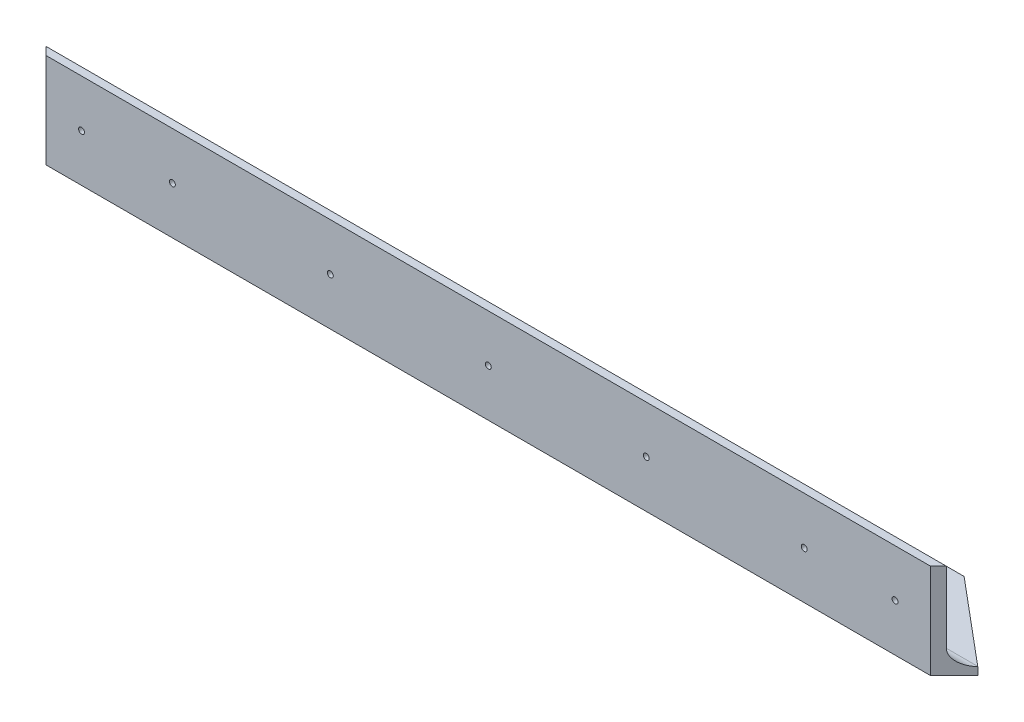
ISO-10303-21;
HEADER;
FILE_DESCRIPTION(('STEP AP214'),'2;1');
FILE_NAME('part.step','',(''),(''),'','','');
FILE_SCHEMA(('AUTOMOTIVE_DESIGN { 1 0 10303 214 1 1 1 1 }'));
ENDSEC;
DATA;
#1=APPLICATION_CONTEXT('core data for automotive mechanical design processes');
#2=APPLICATION_PROTOCOL_DEFINITION('international standard','automotive_design',2000,#1);
#3=PRODUCT_CONTEXT('',#1,'mechanical');
#4=PRODUCT('Part','Part','',(#3));
#5=PRODUCT_RELATED_PRODUCT_CATEGORY('part','',(#4));
#6=PRODUCT_DEFINITION_FORMATION('','',#4);
#7=PRODUCT_DEFINITION_CONTEXT('part definition',#1,'design');
#8=PRODUCT_DEFINITION('design','',#6,#7);
#9=PRODUCT_DEFINITION_SHAPE('','',#8);
#10=(LENGTH_UNIT() NAMED_UNIT(*) SI_UNIT(.MILLI.,.METRE.));
#11=(NAMED_UNIT(*) PLANE_ANGLE_UNIT() SI_UNIT($,.RADIAN.));
#12=(NAMED_UNIT(*) SI_UNIT($,.STERADIAN.) SOLID_ANGLE_UNIT());
#13=UNCERTAINTY_MEASURE_WITH_UNIT(LENGTH_MEASURE(1.E-05),#10,'distance_accuracy_value','');
#14=(GEOMETRIC_REPRESENTATION_CONTEXT(3) GLOBAL_UNCERTAINTY_ASSIGNED_CONTEXT((#13)) GLOBAL_UNIT_ASSIGNED_CONTEXT((#10,
#11,#12)) REPRESENTATION_CONTEXT('',''));
#15=CARTESIAN_POINT('',(0.,0.,0.));
#16=DIRECTION('',(0.,0.,1.));
#17=DIRECTION('',(1.,0.,0.));
#18=AXIS2_PLACEMENT_3D('',#15,#16,#17);
#19=CARTESIAN_POINT('',(673.1,38.1000000000001,-6.35000000000001));
#20=DIRECTION('',(0.,0.,-1.));
#21=DIRECTION('',(0.,1.,0.));
#22=AXIS2_PLACEMENT_3D('',#19,#20,#21);
#23=CYLINDRICAL_SURFACE('',#22,2.38125);
#24=CARTESIAN_POINT('',(673.1,38.1000000000001,0.));
#25=DIRECTION('',(0.,0.,-1.));
#26=DIRECTION('',(0.,1.,0.));
#27=AXIS2_PLACEMENT_3D('',#24,#25,#26);
#28=CIRCLE('',#27,2.38125);
#29=CARTESIAN_POINT('',(673.1,40.4812500000001,0.));
#30=VERTEX_POINT('',#29);
#31=EDGE_CURVE('E51',#30,#30,#28,.T.);
#32=ORIENTED_EDGE('',*,*,#31,.F.);
#33=EDGE_LOOP('',(#32));
#34=FACE_BOUND('',#33,.T.);
#35=CARTESIAN_POINT('',(673.1,38.1000000000001,-6.35000000000001));
#36=DIRECTION('',(0.,0.,-1.));
#37=DIRECTION('',(0.,1.,0.));
#38=AXIS2_PLACEMENT_3D('',#35,#36,#37);
#39=CIRCLE('',#38,2.38125);
#40=CARTESIAN_POINT('',(673.1,40.4812500000001,-6.35000000000001));
#41=VERTEX_POINT('',#40);
#42=EDGE_CURVE('E11',#41,#41,#39,.T.);
#43=ORIENTED_EDGE('',*,*,#42,.T.);
#44=EDGE_LOOP('',(#43));
#45=FACE_BOUND('',#44,.T.);
#46=ADVANCED_FACE('F43',(#34,#45),#23,.F.);
#47=CARTESIAN_POINT('',(165.1,38.1000000000001,-6.34999999999999));
#48=DIRECTION('',(0.,0.,-1.));
#49=DIRECTION('',(0.,1.,0.));
#50=AXIS2_PLACEMENT_3D('',#47,#48,#49);
#51=CYLINDRICAL_SURFACE('',#50,2.38125);
#52=CARTESIAN_POINT('',(165.1,38.1000000000001,0.));
#53=DIRECTION('',(0.,0.,-1.));
#54=DIRECTION('',(0.,1.,0.));
#55=AXIS2_PLACEMENT_3D('',#52,#53,#54);
#56=CIRCLE('',#55,2.38125);
#57=CARTESIAN_POINT('',(165.1,40.4812500000001,0.));
#58=VERTEX_POINT('',#57);
#59=EDGE_CURVE('E264',#58,#58,#56,.T.);
#60=ORIENTED_EDGE('',*,*,#59,.F.);
#61=EDGE_LOOP('',(#60));
#62=FACE_BOUND('',#61,.T.);
#63=CARTESIAN_POINT('',(165.1,38.1000000000001,-6.34999999999999));
#64=DIRECTION('',(0.,0.,-1.));
#65=DIRECTION('',(0.,1.,0.));
#66=AXIS2_PLACEMENT_3D('',#63,#64,#65);
#67=CIRCLE('',#66,2.38125);
#68=CARTESIAN_POINT('',(165.1,40.4812500000001,-6.34999999999999));
#69=VERTEX_POINT('',#68);
#70=EDGE_CURVE('E268',#69,#69,#67,.T.);
#71=ORIENTED_EDGE('',*,*,#70,.T.);
#72=EDGE_LOOP('',(#71));
#73=FACE_BOUND('',#72,.T.);
#74=ADVANCED_FACE('F280',(#62,#73),#51,.F.);
#75=CARTESIAN_POINT('',(736.6,6.35,-44.45));
#76=DIRECTION('',(0.,1.,0.));
#77=DIRECTION('',(0.,0.,1.));
#78=AXIS2_PLACEMENT_3D('',#75,#76,#77);
#79=CYLINDRICAL_SURFACE('',#78,3.373501);
#80=CARTESIAN_POINT('',(736.6,0.,-44.45));
#81=DIRECTION('',(0.,1.,0.));
#82=DIRECTION('',(0.,0.,1.));
#83=AXIS2_PLACEMENT_3D('',#80,#81,#82);
#84=CIRCLE('',#83,3.373501);
#85=CARTESIAN_POINT('',(736.6,0.,-41.076499));
#86=VERTEX_POINT('',#85);
#87=EDGE_CURVE('E244',#86,#86,#84,.T.);
#88=ORIENTED_EDGE('',*,*,#87,.F.);
#89=EDGE_LOOP('',(#88));
#90=FACE_BOUND('',#89,.T.);
#91=CARTESIAN_POINT('',(736.6,6.35,-44.45));
#92=DIRECTION('',(0.,1.,0.));
#93=DIRECTION('',(0.,0.,1.));
#94=AXIS2_PLACEMENT_3D('',#91,#92,#93);
#95=CIRCLE('',#94,3.373501);
#96=CARTESIAN_POINT('',(736.6,6.35,-41.076499));
#97=VERTEX_POINT('',#96);
#98=EDGE_CURVE('E248',#97,#97,#95,.T.);
#99=ORIENTED_EDGE('',*,*,#98,.T.);
#100=EDGE_LOOP('',(#99));
#101=FACE_BOUND('',#100,.T.);
#102=ADVANCED_FACE('F327',(#90,#101),#79,.F.);
#103=CARTESIAN_POINT('',(609.6,6.35,-44.45));
#104=DIRECTION('',(0.,1.,0.));
#105=DIRECTION('',(0.,0.,1.));
#106=AXIS2_PLACEMENT_3D('',#103,#104,#105);
#107=CYLINDRICAL_SURFACE('',#106,3.373501);
#108=CARTESIAN_POINT('',(609.6,0.,-44.45));
#109=DIRECTION('',(0.,1.,0.));
#110=DIRECTION('',(0.,0.,1.));
#111=AXIS2_PLACEMENT_3D('',#108,#109,#110);
#112=CIRCLE('',#111,3.373501);
#113=CARTESIAN_POINT('',(609.6,0.,-41.076499));
#114=VERTEX_POINT('',#113);
#115=EDGE_CURVE('E236',#114,#114,#112,.T.);
#116=ORIENTED_EDGE('',*,*,#115,.F.);
#117=EDGE_LOOP('',(#116));
#118=FACE_BOUND('',#117,.T.);
#119=CARTESIAN_POINT('',(609.6,6.35,-44.45));
#120=DIRECTION('',(0.,1.,0.));
#121=DIRECTION('',(0.,0.,1.));
#122=AXIS2_PLACEMENT_3D('',#119,#120,#121);
#123=CIRCLE('',#122,3.373501);
#124=CARTESIAN_POINT('',(609.6,6.35,-41.076499));
#125=VERTEX_POINT('',#124);
#126=EDGE_CURVE('E240',#125,#125,#123,.T.);
#127=ORIENTED_EDGE('',*,*,#126,.T.);
#128=EDGE_LOOP('',(#127));
#129=FACE_BOUND('',#128,.T.);
#130=ADVANCED_FACE('F323',(#118,#129),#107,.F.);
#131=CARTESIAN_POINT('',(482.6,6.35,-44.45));
#132=DIRECTION('',(0.,1.,0.));
#133=DIRECTION('',(0.,0.,1.));
#134=AXIS2_PLACEMENT_3D('',#131,#132,#133);
#135=CYLINDRICAL_SURFACE('',#134,3.373501);
#136=CARTESIAN_POINT('',(482.6,0.,-44.45));
#137=DIRECTION('',(0.,1.,0.));
#138=DIRECTION('',(0.,0.,1.));
#139=AXIS2_PLACEMENT_3D('',#136,#137,#138);
#140=CIRCLE('',#139,3.373501);
#141=CARTESIAN_POINT('',(482.6,0.,-41.076499));
#142=VERTEX_POINT('',#141);
#143=EDGE_CURVE('E228',#142,#142,#140,.T.);
#144=ORIENTED_EDGE('',*,*,#143,.F.);
#145=EDGE_LOOP('',(#144));
#146=FACE_BOUND('',#145,.T.);
#147=CARTESIAN_POINT('',(482.6,6.35,-44.45));
#148=DIRECTION('',(0.,1.,0.));
#149=DIRECTION('',(0.,0.,1.));
#150=AXIS2_PLACEMENT_3D('',#147,#148,#149);
#151=CIRCLE('',#150,3.373501);
#152=CARTESIAN_POINT('',(482.6,6.35,-41.076499));
#153=VERTEX_POINT('',#152);
#154=EDGE_CURVE('E232',#153,#153,#151,.T.);
#155=ORIENTED_EDGE('',*,*,#154,.T.);
#156=EDGE_LOOP('',(#155));
#157=FACE_BOUND('',#156,.T.);
#158=ADVANCED_FACE('F319',(#146,#157),#135,.F.);
#159=CARTESIAN_POINT('',(355.6,6.35,-44.45));
#160=DIRECTION('',(0.,1.,0.));
#161=DIRECTION('',(0.,0.,1.));
#162=AXIS2_PLACEMENT_3D('',#159,#160,#161);
#163=CYLINDRICAL_SURFACE('',#162,3.373501);
#164=CARTESIAN_POINT('',(355.6,0.,-44.45));
#165=DIRECTION('',(0.,1.,0.));
#166=DIRECTION('',(0.,0.,1.));
#167=AXIS2_PLACEMENT_3D('',#164,#165,#166);
#168=CIRCLE('',#167,3.373501);
#169=CARTESIAN_POINT('',(355.6,0.,-41.076499));
#170=VERTEX_POINT('',#169);
#171=EDGE_CURVE('E220',#170,#170,#168,.T.);
#172=ORIENTED_EDGE('',*,*,#171,.F.);
#173=EDGE_LOOP('',(#172));
#174=FACE_BOUND('',#173,.T.);
#175=CARTESIAN_POINT('',(355.6,6.35,-44.45));
#176=DIRECTION('',(0.,1.,0.));
#177=DIRECTION('',(0.,0.,1.));
#178=AXIS2_PLACEMENT_3D('',#175,#176,#177);
#179=CIRCLE('',#178,3.373501);
#180=CARTESIAN_POINT('',(355.6,6.35,-41.076499));
#181=VERTEX_POINT('',#180);
#182=EDGE_CURVE('E224',#181,#181,#179,.T.);
#183=ORIENTED_EDGE('',*,*,#182,.T.);
#184=EDGE_LOOP('',(#183));
#185=FACE_BOUND('',#184,.T.);
#186=ADVANCED_FACE('F311',(#174,#185),#163,.F.);
#187=CARTESIAN_POINT('',(838.2,76.2,0.));
#188=DIRECTION('',(0.,0.,-1.));
#189=DIRECTION('',(0.,1.,0.));
#190=AXIS2_PLACEMENT_3D('',#187,#188,#189);
#191=PLANE('',#190);
#192=CARTESIAN_POINT('',(746.125,38.1,0.));
#193=DIRECTION('',(0.,0.,-1.));
#194=DIRECTION('',(0.,1.,0.));
#195=AXIS2_PLACEMENT_3D('',#192,#193,#194);
#196=CIRCLE('',#195,2.38125);
#197=CARTESIAN_POINT('',(746.125,40.48125,0.));
#198=VERTEX_POINT('',#197);
#199=EDGE_CURVE('E616',#198,#198,#196,.T.);
#200=ORIENTED_EDGE('',*,*,#199,.T.);
#201=EDGE_LOOP('',(#200));
#202=FACE_BOUND('',#201,.T.);
#203=CARTESIAN_POINT('',(92.075,38.1,0.));
#204=DIRECTION('',(0.,0.,-1.));
#205=DIRECTION('',(0.,1.,0.));
#206=AXIS2_PLACEMENT_3D('',#203,#204,#205);
#207=CIRCLE('',#206,2.38125);
#208=CARTESIAN_POINT('',(92.075,40.48125,0.));
#209=VERTEX_POINT('',#208);
#210=EDGE_CURVE('E608',#209,#209,#207,.T.);
#211=ORIENTED_EDGE('',*,*,#210,.T.);
#212=EDGE_LOOP('',(#211));
#213=FACE_BOUND('',#212,.T.);
#214=CARTESIAN_POINT('',(546.1,38.1000000000001,0.));
#215=DIRECTION('',(0.,0.,-1.));
#216=DIRECTION('',(0.,1.,0.));
#217=AXIS2_PLACEMENT_3D('',#214,#215,#216);
#218=CIRCLE('',#217,2.38125);
#219=CARTESIAN_POINT('',(546.1,40.4812500000001,0.));
#220=VERTEX_POINT('',#219);
#221=EDGE_CURVE('E604',#220,#220,#218,.T.);
#222=ORIENTED_EDGE('',*,*,#221,.T.);
#223=EDGE_LOOP('',(#222));
#224=FACE_BOUND('',#223,.T.);
#225=CARTESIAN_POINT('',(292.1,38.1000000000001,0.));
#226=DIRECTION('',(0.,0.,-1.));
#227=DIRECTION('',(0.,1.,0.));
#228=AXIS2_PLACEMENT_3D('',#225,#226,#227);
#229=CIRCLE('',#228,2.38125);
#230=CARTESIAN_POINT('',(292.1,40.4812500000001,0.));
#231=VERTEX_POINT('',#230);
#232=EDGE_CURVE('E596',#231,#231,#229,.T.);
#233=ORIENTED_EDGE('',*,*,#232,.T.);
#234=EDGE_LOOP('',(#233));
#235=FACE_BOUND('',#234,.T.);
#236=CARTESIAN_POINT('',(419.1,38.1000000000001,0.));
#237=DIRECTION('',(0.,0.,-1.));
#238=DIRECTION('',(0.,1.,0.));
#239=AXIS2_PLACEMENT_3D('',#236,#237,#238);
#240=CIRCLE('',#239,2.38125);
#241=CARTESIAN_POINT('',(419.1,40.4812500000001,0.));
#242=VERTEX_POINT('',#241);
#243=EDGE_CURVE('E584',#242,#242,#240,.T.);
#244=ORIENTED_EDGE('',*,*,#243,.T.);
#245=EDGE_LOOP('',(#244));
#246=FACE_BOUND('',#245,.T.);
#247=DIRECTION('',(-1.,0.,0.));
#248=VECTOR('',#247,1.);
#249=CARTESIAN_POINT('',(838.2,0.,0.));
#250=LINE('',#249,#248);
#251=CARTESIAN_POINT('',(774.7,0.,0.));
#252=VERTEX_POINT('',#251);
#253=CARTESIAN_POINT('',(63.5,0.,0.));
#254=VERTEX_POINT('',#253);
#255=EDGE_CURVE('E210',#252,#254,#250,.T.);
#256=ORIENTED_EDGE('',*,*,#255,.F.);
#257=DIRECTION('',(0.,-1.,0.));
#258=VECTOR('',#257,1.);
#259=CARTESIAN_POINT('',(774.7,76.2,0.));
#260=LINE('',#259,#258);
#261=CARTESIAN_POINT('',(774.7,76.2,0.));
#262=VERTEX_POINT('',#261);
#263=EDGE_CURVE('E147',#262,#252,#260,.T.);
#264=ORIENTED_EDGE('',*,*,#263,.F.);
#265=DIRECTION('',(-1.,0.,0.));
#266=VECTOR('',#265,1.);
#267=CARTESIAN_POINT('',(838.2,76.2,0.));
#268=LINE('',#267,#266);
#269=CARTESIAN_POINT('',(63.5,76.2,0.));
#270=VERTEX_POINT('',#269);
#271=EDGE_CURVE('E199',#262,#270,#268,.T.);
#272=ORIENTED_EDGE('',*,*,#271,.T.);
#273=DIRECTION('',(0.,-1.,0.));
#274=VECTOR('',#273,1.);
#275=CARTESIAN_POINT('',(63.5,76.2,0.));
#276=LINE('',#275,#274);
#277=EDGE_CURVE('E173',#270,#254,#276,.T.);
#278=ORIENTED_EDGE('',*,*,#277,.T.);
#279=EDGE_LOOP('',(#256,#264,#272,#278));
#280=FACE_BOUND('',#279,.T.);
#281=ORIENTED_EDGE('',*,*,#59,.T.);
#282=EDGE_LOOP('',(#281));
#283=FACE_BOUND('',#282,.T.);
#284=ORIENTED_EDGE('',*,*,#31,.T.);
#285=EDGE_LOOP('',(#284));
#286=FACE_BOUND('',#285,.T.);
#287=ADVANCED_FACE('F276',(#202,#213,#224,#235,#246,#280,#283,#286),#191,.F.);
#288=CARTESIAN_POINT('',(838.2,0.,0.));
#289=DIRECTION('',(0.,1.,0.));
#290=DIRECTION('',(0.,0.,1.));
#291=AXIS2_PLACEMENT_3D('',#288,#289,#290);
#292=PLANE('',#291);
#293=CARTESIAN_POINT('',(228.6,0.,-44.45));
#294=DIRECTION('',(0.,1.,0.));
#295=DIRECTION('',(0.,0.,1.));
#296=AXIS2_PLACEMENT_3D('',#293,#294,#295);
#297=CIRCLE('',#296,3.373501);
#298=CARTESIAN_POINT('',(228.6,0.,-41.076499));
#299=VERTEX_POINT('',#298);
#300=EDGE_CURVE('E183',#299,#299,#297,.T.);
#301=ORIENTED_EDGE('',*,*,#300,.T.);
#302=EDGE_LOOP('',(#301));
#303=FACE_BOUND('',#302,.T.);
#304=CARTESIAN_POINT('',(101.6,0.,-44.45));
#305=DIRECTION('',(0.,1.,0.));
#306=DIRECTION('',(0.,0.,1.));
#307=AXIS2_PLACEMENT_3D('',#304,#305,#306);
#308=CIRCLE('',#307,3.373501);
#309=CARTESIAN_POINT('',(101.6,0.,-41.076499));
#310=VERTEX_POINT('',#309);
#311=EDGE_CURVE('E195',#310,#310,#308,.T.);
#312=ORIENTED_EDGE('',*,*,#311,.T.);
#313=EDGE_LOOP('',(#312));
#314=FACE_BOUND('',#313,.T.);
#315=DIRECTION('',(-1.,0.,0.));
#316=VECTOR('',#315,1.);
#317=CARTESIAN_POINT('',(838.2,0.,-76.2));
#318=LINE('',#317,#316);
#319=CARTESIAN_POINT('',(725.42400757447,0.,-76.2));
#320=VERTEX_POINT('',#319);
#321=CARTESIAN_POINT('',(112.775992425529,0.,-76.2));
#322=VERTEX_POINT('',#321);
#323=EDGE_CURVE('E141',#320,#322,#318,.T.);
#324=ORIENTED_EDGE('',*,*,#323,.F.);
#325=DIRECTION('',(0.766044443118975,0.,0.642787609686542));
#326=VECTOR('',#325,1.);
#327=CARTESIAN_POINT('',(725.42400757447,0.,-76.2));
#328=LINE('',#327,#326);
#329=CARTESIAN_POINT('',(793.650867228184,0.,-18.9508672281842));
#330=VERTEX_POINT('',#329);
#331=EDGE_CURVE('E124',#320,#330,#328,.T.);
#332=ORIENTED_EDGE('',*,*,#331,.T.);
#333=DIRECTION('',(0.707106781186551,0.,-0.707106781186544));
#334=VECTOR('',#333,1.);
#335=CARTESIAN_POINT('',(864.325160154726,0.,-89.6251601547247));
#336=LINE('',#335,#334);
#337=EDGE_CURVE('E138',#252,#330,#336,.T.);
#338=ORIENTED_EDGE('',*,*,#337,.F.);
#339=ORIENTED_EDGE('',*,*,#255,.T.);
#340=DIRECTION('',(0.707106781186551,0.,0.707106781186544));
#341=VECTOR('',#340,1.);
#342=CARTESIAN_POINT('',(-28.0524500593167,0.,-91.5524500593158));
#343=LINE('',#342,#341);
#344=CARTESIAN_POINT('',(44.5491327718152,0.,-18.9508672281842));
#345=VERTEX_POINT('',#344);
#346=EDGE_CURVE('E168',#345,#254,#343,.T.);
#347=ORIENTED_EDGE('',*,*,#346,.F.);
#348=DIRECTION('',(0.766044443118976,0.,-0.642787609686542));
#349=VECTOR('',#348,1.);
#350=CARTESIAN_POINT('',(44.5491327718152,0.,-18.9508672281842));
#351=LINE('',#350,#349);
#352=EDGE_CURVE('E562',#345,#322,#351,.T.);
#353=ORIENTED_EDGE('',*,*,#352,.T.);
#354=EDGE_LOOP('',(#324,#332,#338,#339,#347,#353));
#355=FACE_BOUND('',#354,.T.);
#356=ORIENTED_EDGE('',*,*,#171,.T.);
#357=EDGE_LOOP('',(#356));
#358=FACE_BOUND('',#357,.T.);
#359=ORIENTED_EDGE('',*,*,#143,.T.);
#360=EDGE_LOOP('',(#359));
#361=FACE_BOUND('',#360,.T.);
#362=ORIENTED_EDGE('',*,*,#115,.T.);
#363=EDGE_LOOP('',(#362));
#364=FACE_BOUND('',#363,.T.);
#365=ORIENTED_EDGE('',*,*,#87,.T.);
#366=EDGE_LOOP('',(#365));
#367=FACE_BOUND('',#366,.T.);
#368=ADVANCED_FACE('F135',(#303,#314,#355,#358,#361,#364,#367),#292,.F.);
#369=CARTESIAN_POINT('',(838.2,0.,-76.2));
#370=DIRECTION('',(0.,0.,1.));
#371=DIRECTION('',(1.,0.,0.));
#372=AXIS2_PLACEMENT_3D('',#369,#370,#371);
#373=PLANE('',#372);
#374=DIRECTION('',(-1.,0.,0.));
#375=VECTOR('',#374,1.);
#376=CARTESIAN_POINT('',(838.2,6.35,-76.2));
#377=LINE('',#376,#375);
#378=CARTESIAN_POINT('',(725.42400757447,6.35,-76.2));
#379=VERTEX_POINT('',#378);
#380=CARTESIAN_POINT('',(112.775992425529,6.35,-76.2));
#381=VERTEX_POINT('',#380);
#382=EDGE_CURVE('E205',#379,#381,#377,.T.);
#383=ORIENTED_EDGE('',*,*,#382,.F.);
#384=DIRECTION('',(0.,1.,0.));
#385=VECTOR('',#384,1.);
#386=CARTESIAN_POINT('',(725.42400757447,0.,-76.2));
#387=LINE('',#386,#385);
#388=EDGE_CURVE('E130',#320,#379,#387,.T.);
#389=ORIENTED_EDGE('',*,*,#388,.F.);
#390=ORIENTED_EDGE('',*,*,#323,.T.);
#391=DIRECTION('',(0.,1.,0.));
#392=VECTOR('',#391,1.);
#393=CARTESIAN_POINT('',(112.775992425529,0.,-76.2));
#394=LINE('',#393,#392);
#395=EDGE_CURVE('E150',#322,#381,#394,.T.);
#396=ORIENTED_EDGE('',*,*,#395,.T.);
#397=EDGE_LOOP('',(#383,#389,#390,#396));
#398=FACE_BOUND('',#397,.T.);
#399=ADVANCED_FACE('F296',(#398),#373,.F.);
#400=CARTESIAN_POINT('',(838.2,6.35,-76.2));
#401=DIRECTION('',(0.,-1.,0.));
#402=DIRECTION('',(0.,0.,-1.));
#403=AXIS2_PLACEMENT_3D('',#400,#401,#402);
#404=PLANE('',#403);
#405=CARTESIAN_POINT('',(228.6,6.35,-44.45));
#406=DIRECTION('',(0.,1.,0.));
#407=DIRECTION('',(0.,0.,1.));
#408=AXIS2_PLACEMENT_3D('',#405,#406,#407);
#409=CIRCLE('',#408,3.373501);
#410=CARTESIAN_POINT('',(228.6,6.35,-41.076499));
#411=VERTEX_POINT('',#410);
#412=EDGE_CURVE('E187',#411,#411,#409,.T.);
#413=ORIENTED_EDGE('',*,*,#412,.F.);
#414=EDGE_LOOP('',(#413));
#415=FACE_BOUND('',#414,.T.);
#416=CARTESIAN_POINT('',(101.6,6.35,-44.45));
#417=DIRECTION('',(0.,1.,0.));
#418=DIRECTION('',(0.,0.,1.));
#419=AXIS2_PLACEMENT_3D('',#416,#417,#418);
#420=CIRCLE('',#419,3.373501);
#421=CARTESIAN_POINT('',(101.6,6.35,-41.076499));
#422=VERTEX_POINT('',#421);
#423=EDGE_CURVE('E191',#422,#422,#420,.T.);
#424=ORIENTED_EDGE('',*,*,#423,.F.);
#425=EDGE_LOOP('',(#424));
#426=FACE_BOUND('',#425,.T.);
#427=DIRECTION('',(-1.,0.,0.));
#428=VECTOR('',#427,1.);
#429=CARTESIAN_POINT('',(838.2,6.34999999999999,-19.05));
#430=LINE('',#429,#428);
#431=CARTESIAN_POINT('',(44.6672746087706,6.34999999999999,-19.05));
#432=VERTEX_POINT('',#431);
#433=CARTESIAN_POINT('',(793.532725391229,6.34999999999999,-19.05));
#434=VERTEX_POINT('',#433);
#435=EDGE_CURVE('E216',#432,#434,#430,.F.);
#436=ORIENTED_EDGE('',*,*,#435,.T.);
#437=DIRECTION('',(0.766044443118975,0.,0.642787609686542));
#438=VECTOR('',#437,1.);
#439=CARTESIAN_POINT('',(725.42400757447,6.35,-76.2));
#440=LINE('',#439,#438);
#441=EDGE_CURVE('E515',#379,#434,#440,.T.);
#442=ORIENTED_EDGE('',*,*,#441,.F.);
#443=ORIENTED_EDGE('',*,*,#382,.T.);
#444=DIRECTION('',(0.766044443118976,0.,-0.642787609686542));
#445=VECTOR('',#444,1.);
#446=CARTESIAN_POINT('',(44.5491327718152,6.34999999999999,-18.9508672281842));
#447=LINE('',#446,#445);
#448=EDGE_CURVE('E518',#432,#381,#447,.T.);
#449=ORIENTED_EDGE('',*,*,#448,.F.);
#450=EDGE_LOOP('',(#436,#442,#443,#449));
#451=FACE_BOUND('',#450,.T.);
#452=ORIENTED_EDGE('',*,*,#182,.F.);
#453=EDGE_LOOP('',(#452));
#454=FACE_BOUND('',#453,.T.);
#455=ORIENTED_EDGE('',*,*,#154,.F.);
#456=EDGE_LOOP('',(#455));
#457=FACE_BOUND('',#456,.T.);
#458=ORIENTED_EDGE('',*,*,#126,.F.);
#459=EDGE_LOOP('',(#458));
#460=FACE_BOUND('',#459,.T.);
#461=ORIENTED_EDGE('',*,*,#98,.F.);
#462=EDGE_LOOP('',(#461));
#463=FACE_BOUND('',#462,.T.);
#464=ADVANCED_FACE('F286',(#415,#426,#451,#454,#457,#460,#463),#404,.F.);
#465=CARTESIAN_POINT('',(838.2,6.34999999999999,-6.34999999999999));
#466=DIRECTION('',(0.,0.,1.));
#467=DIRECTION('',(0.,-1.,0.));
#468=AXIS2_PLACEMENT_3D('',#465,#466,#467);
#469=PLANE('',#468);
#470=CARTESIAN_POINT('',(746.125,38.1,-6.35));
#471=DIRECTION('',(0.,0.,-1.));
#472=DIRECTION('',(0.,1.,0.));
#473=AXIS2_PLACEMENT_3D('',#470,#471,#472);
#474=CIRCLE('',#473,2.38125);
#475=CARTESIAN_POINT('',(746.125,40.48125,-6.35));
#476=VERTEX_POINT('',#475);
#477=EDGE_CURVE('E620',#476,#476,#474,.T.);
#478=ORIENTED_EDGE('',*,*,#477,.F.);
#479=EDGE_LOOP('',(#478));
#480=FACE_BOUND('',#479,.T.);
#481=CARTESIAN_POINT('',(92.075,38.1,-6.35));
#482=DIRECTION('',(0.,0.,-1.));
#483=DIRECTION('',(0.,1.,0.));
#484=AXIS2_PLACEMENT_3D('',#481,#482,#483);
#485=CIRCLE('',#484,2.38124999999999);
#486=CARTESIAN_POINT('',(92.075,40.48125,-6.35));
#487=VERTEX_POINT('',#486);
#488=EDGE_CURVE('E612',#487,#487,#485,.T.);
#489=ORIENTED_EDGE('',*,*,#488,.F.);
#490=EDGE_LOOP('',(#489));
#491=FACE_BOUND('',#490,.T.);
#492=CARTESIAN_POINT('',(546.1,38.1000000000001,-6.35));
#493=DIRECTION('',(0.,0.,-1.));
#494=DIRECTION('',(0.,1.,0.));
#495=AXIS2_PLACEMENT_3D('',#492,#493,#494);
#496=CIRCLE('',#495,2.38125);
#497=CARTESIAN_POINT('',(546.1,40.4812500000001,-6.35));
#498=VERTEX_POINT('',#497);
#499=EDGE_CURVE('E600',#498,#498,#496,.T.);
#500=ORIENTED_EDGE('',*,*,#499,.F.);
#501=EDGE_LOOP('',(#500));
#502=FACE_BOUND('',#501,.T.);
#503=CARTESIAN_POINT('',(292.1,38.1000000000001,-6.34999999999999));
#504=DIRECTION('',(0.,0.,-1.));
#505=DIRECTION('',(0.,1.,0.));
#506=AXIS2_PLACEMENT_3D('',#503,#504,#505);
#507=CIRCLE('',#506,2.38125);
#508=CARTESIAN_POINT('',(292.1,40.4812500000001,-6.34999999999999));
#509=VERTEX_POINT('',#508);
#510=EDGE_CURVE('E592',#509,#509,#507,.T.);
#511=ORIENTED_EDGE('',*,*,#510,.F.);
#512=EDGE_LOOP('',(#511));
#513=FACE_BOUND('',#512,.T.);
#514=CARTESIAN_POINT('',(419.1,38.1000000000001,-6.35));
#515=DIRECTION('',(0.,0.,-1.));
#516=DIRECTION('',(0.,1.,0.));
#517=AXIS2_PLACEMENT_3D('',#514,#515,#516);
#518=CIRCLE('',#517,2.38125);
#519=CARTESIAN_POINT('',(419.1,40.4812500000001,-6.35));
#520=VERTEX_POINT('',#519);
#521=EDGE_CURVE('E588',#520,#520,#518,.T.);
#522=ORIENTED_EDGE('',*,*,#521,.F.);
#523=EDGE_LOOP('',(#522));
#524=FACE_BOUND('',#523,.T.);
#525=DIRECTION('',(-1.,0.,0.));
#526=VECTOR('',#525,1.);
#527=CARTESIAN_POINT('',(838.2,76.2,-6.35));
#528=LINE('',#527,#526);
#529=CARTESIAN_POINT('',(781.05,76.2,-6.34999999999998));
#530=VERTEX_POINT('',#529);
#531=CARTESIAN_POINT('',(57.1500000000001,76.2,-6.34999999999995));
#532=VERTEX_POINT('',#531);
#533=EDGE_CURVE('E202',#530,#532,#528,.T.);
#534=ORIENTED_EDGE('',*,*,#533,.F.);
#535=DIRECTION('',(0.,-1.,0.));
#536=VECTOR('',#535,1.);
#537=CARTESIAN_POINT('',(781.05,6.35,-6.34999999999999));
#538=LINE('',#537,#536);
#539=CARTESIAN_POINT('',(781.05,19.05,-6.35));
#540=VERTEX_POINT('',#539);
#541=EDGE_CURVE('E164',#530,#540,#538,.T.);
#542=ORIENTED_EDGE('',*,*,#541,.T.);
#543=DIRECTION('',(-1.,0.,0.));
#544=VECTOR('',#543,1.);
#545=CARTESIAN_POINT('',(0.,19.05,-6.35));
#546=LINE('',#545,#544);
#547=CARTESIAN_POINT('',(57.1499999999999,19.05,-6.35));
#548=VERTEX_POINT('',#547);
#549=EDGE_CURVE('E213',#540,#548,#546,.T.);
#550=ORIENTED_EDGE('',*,*,#549,.T.);
#551=DIRECTION('',(0.,1.,0.));
#552=VECTOR('',#551,1.);
#553=CARTESIAN_POINT('',(57.15,6.34999999999993,-6.34999999999999));
#554=LINE('',#553,#552);
#555=EDGE_CURVE('E179',#548,#532,#554,.T.);
#556=ORIENTED_EDGE('',*,*,#555,.T.);
#557=EDGE_LOOP('',(#534,#542,#550,#556));
#558=FACE_BOUND('',#557,.T.);
#559=ORIENTED_EDGE('',*,*,#70,.F.);
#560=EDGE_LOOP('',(#559));
#561=FACE_BOUND('',#560,.T.);
#562=ORIENTED_EDGE('',*,*,#42,.F.);
#563=EDGE_LOOP('',(#562));
#564=FACE_BOUND('',#563,.T.);
#565=ADVANCED_FACE('F283',(#480,#491,#502,#513,#524,#558,#561,#564),#469,.F.);
#566=CARTESIAN_POINT('',(838.2,76.2,-6.35));
#567=DIRECTION('',(0.,-1.,0.));
#568=DIRECTION('',(0.,0.,-1.));
#569=AXIS2_PLACEMENT_3D('',#566,#567,#568);
#570=PLANE('',#569);
#571=ORIENTED_EDGE('',*,*,#271,.F.);
#572=DIRECTION('',(0.707106781186551,0.,-0.707106781186544));
#573=VECTOR('',#572,1.);
#574=CARTESIAN_POINT('',(864.325160154726,76.2,-89.6251601547247));
#575=LINE('',#574,#573);
#576=EDGE_CURVE('E149',#262,#530,#575,.T.);
#577=ORIENTED_EDGE('',*,*,#576,.T.);
#578=ORIENTED_EDGE('',*,*,#533,.T.);
#579=DIRECTION('',(0.707106781186551,0.,0.707106781186544));
#580=VECTOR('',#579,1.);
#581=CARTESIAN_POINT('',(-28.0524500593167,76.2,-91.5524500593158));
#582=LINE('',#581,#580);
#583=EDGE_CURVE('E169',#532,#270,#582,.T.);
#584=ORIENTED_EDGE('',*,*,#583,.T.);
#585=EDGE_LOOP('',(#571,#577,#578,#584));
#586=FACE_BOUND('',#585,.T.);
#587=ADVANCED_FACE('F285',(#586),#570,.F.);
#588=CARTESIAN_POINT('',(838.2,19.05,-19.05));
#589=DIRECTION('',(1.,0.,0.));
#590=DIRECTION('',(0.,0.,-1.));
#591=AXIS2_PLACEMENT_3D('',#588,#589,#590);
#592=CYLINDRICAL_SURFACE('',#591,12.7);
#593=ORIENTED_EDGE('',*,*,#549,.F.);
#594=CARTESIAN_POINT('',(793.75,19.05,-19.05));
#595=DIRECTION('',(-0.707106781186544,0.,-0.707106781186551));
#596=DIRECTION('',(0.707106781186551,0.,-0.707106781186544));
#597=AXIS2_PLACEMENT_3D('',#594,#595,#596);
#598=ELLIPSE('',#597,17.9605122421384,12.7);
#599=CARTESIAN_POINT('',(793.75,6.34999999999999,-19.05));
#600=VERTEX_POINT('',#599);
#601=EDGE_CURVE('E256',#540,#600,#598,.F.);
#602=ORIENTED_EDGE('',*,*,#601,.T.);
#603=DIRECTION('',(1.,0.,0.));
#604=VECTOR('',#603,1.);
#605=CARTESIAN_POINT('',(838.2,6.34999999999999,-19.05));
#606=LINE('',#605,#604);
#607=EDGE_CURVE('E66',#600,#434,#606,.F.);
#608=ORIENTED_EDGE('',*,*,#607,.T.);
#609=ORIENTED_EDGE('',*,*,#435,.F.);
#610=CARTESIAN_POINT('',(44.4499999999995,6.34999999999999,-19.0499999999998));
#611=VERTEX_POINT('',#610);
#612=EDGE_CURVE('E217',#611,#432,#430,.F.);
#613=ORIENTED_EDGE('',*,*,#612,.F.);
#614=CARTESIAN_POINT('',(44.4499999999998,19.05,-19.05));
#615=DIRECTION('',(0.707106781186544,0.,-0.707106781186551));
#616=DIRECTION('',(0.707106781186551,0.,0.707106781186544));
#617=AXIS2_PLACEMENT_3D('',#614,#615,#616);
#618=ELLIPSE('',#617,17.9605122421384,12.7);
#619=EDGE_CURVE('E252',#611,#548,#618,.F.);
#620=ORIENTED_EDGE('',*,*,#619,.T.);
#621=EDGE_LOOP('',(#593,#602,#608,#609,#613,#620));
#622=FACE_BOUND('',#621,.T.);
#623=ADVANCED_FACE('F293',(#622),#592,.F.);
#624=CARTESIAN_POINT('',(101.6,6.35,-44.45));
#625=DIRECTION('',(0.,1.,0.));
#626=DIRECTION('',(0.,0.,1.));
#627=AXIS2_PLACEMENT_3D('',#624,#625,#626);
#628=CYLINDRICAL_SURFACE('',#627,3.373501);
#629=ORIENTED_EDGE('',*,*,#311,.F.);
#630=EDGE_LOOP('',(#629));
#631=FACE_BOUND('',#630,.T.);
#632=ORIENTED_EDGE('',*,*,#423,.T.);
#633=EDGE_LOOP('',(#632));
#634=FACE_BOUND('',#633,.T.);
#635=ADVANCED_FACE('F315',(#631,#634),#628,.F.);
#636=CARTESIAN_POINT('',(228.6,6.35,-44.45));
#637=DIRECTION('',(0.,1.,0.));
#638=DIRECTION('',(0.,0.,1.));
#639=AXIS2_PLACEMENT_3D('',#636,#637,#638);
#640=CYLINDRICAL_SURFACE('',#639,3.373501);
#641=ORIENTED_EDGE('',*,*,#300,.F.);
#642=EDGE_LOOP('',(#641));
#643=FACE_BOUND('',#642,.T.);
#644=ORIENTED_EDGE('',*,*,#412,.T.);
#645=EDGE_LOOP('',(#644));
#646=FACE_BOUND('',#645,.T.);
#647=ADVANCED_FACE('F488',(#643,#646),#640,.F.);
#648=CARTESIAN_POINT('',(-28.0524500593167,76.2,-91.5524500593158));
#649=DIRECTION('',(0.707106781186544,0.,-0.707106781186551));
#650=DIRECTION('',(-0.707106781186551,0.,-0.707106781186544));
#651=AXIS2_PLACEMENT_3D('',#648,#649,#650);
#652=PLANE('',#651);
#653=DIRECTION('',(0.707106781186551,0.,0.707106781186544));
#654=VECTOR('',#653,1.);
#655=CARTESIAN_POINT('',(-28.0524500593167,6.35000000000001,-91.5524500593158));
#656=LINE('',#655,#654);
#657=CARTESIAN_POINT('',(44.5491327718157,6.35,-18.9508672281841));
#658=VERTEX_POINT('',#657);
#659=EDGE_CURVE('E260',#611,#658,#656,.T.);
#660=ORIENTED_EDGE('',*,*,#659,.T.);
#661=DIRECTION('',(0.,1.,0.));
#662=VECTOR('',#661,1.);
#663=CARTESIAN_POINT('',(44.5491327718152,0.,-18.9508672281842));
#664=LINE('',#663,#662);
#665=EDGE_CURVE('E158',#345,#658,#664,.T.);
#666=ORIENTED_EDGE('',*,*,#665,.F.);
#667=ORIENTED_EDGE('',*,*,#346,.T.);
#668=ORIENTED_EDGE('',*,*,#277,.F.);
#669=ORIENTED_EDGE('',*,*,#583,.F.);
#670=ORIENTED_EDGE('',*,*,#555,.F.);
#671=ORIENTED_EDGE('',*,*,#619,.F.);
#672=EDGE_LOOP('',(#660,#666,#667,#668,#669,#670,#671));
#673=FACE_BOUND('',#672,.T.);
#674=ADVANCED_FACE('F400',(#673),#652,.F.);
#675=CARTESIAN_POINT('',(864.325160154726,76.2,-89.6251601547247));
#676=DIRECTION('',(-0.707106781186544,0.,-0.707106781186551));
#677=DIRECTION('',(-0.707106781186551,0.,0.707106781186544));
#678=AXIS2_PLACEMENT_3D('',#675,#676,#677);
#679=PLANE('',#678);
#680=ORIENTED_EDGE('',*,*,#337,.T.);
#681=DIRECTION('',(0.,1.,0.));
#682=VECTOR('',#681,1.);
#683=CARTESIAN_POINT('',(793.650867228184,0.,-18.9508672281842));
#684=LINE('',#683,#682);
#685=CARTESIAN_POINT('',(793.650867228184,6.34999999999999,-18.9508672281842));
#686=VERTEX_POINT('',#685);
#687=EDGE_CURVE('E120',#330,#686,#684,.T.);
#688=ORIENTED_EDGE('',*,*,#687,.T.);
#689=DIRECTION('',(0.707106781186548,0.,-0.707106781186547));
#690=VECTOR('',#689,1.);
#691=CARTESIAN_POINT('',(793.650867228184,6.34999999999999,-18.9508672281842));
#692=LINE('',#691,#690);
#693=EDGE_CURVE('E143',#686,#600,#692,.T.);
#694=ORIENTED_EDGE('',*,*,#693,.T.);
#695=ORIENTED_EDGE('',*,*,#601,.F.);
#696=ORIENTED_EDGE('',*,*,#541,.F.);
#697=ORIENTED_EDGE('',*,*,#576,.F.);
#698=ORIENTED_EDGE('',*,*,#263,.T.);
#699=EDGE_LOOP('',(#680,#688,#694,#695,#696,#697,#698));
#700=FACE_BOUND('',#699,.T.);
#701=ADVANCED_FACE('F145',(#700),#679,.F.);
#702=CARTESIAN_POINT('',(0.,6.34999999999999,0.));
#703=DIRECTION('',(0.,1.,0.));
#704=DIRECTION('',(0.,0.,1.));
#705=AXIS2_PLACEMENT_3D('',#702,#703,#704);
#706=PLANE('',#705);
#707=EDGE_CURVE('E58',#658,#432,#447,.T.);
#708=ORIENTED_EDGE('',*,*,#707,.F.);
#709=ORIENTED_EDGE('',*,*,#659,.F.);
#710=ORIENTED_EDGE('',*,*,#612,.T.);
#711=EDGE_LOOP('',(#708,#709,#710));
#712=FACE_BOUND('',#711,.T.);
#713=ADVANCED_FACE('F399',(#712),#706,.F.);
#714=CARTESIAN_POINT('',(44.5491327718152,0.,-18.9508672281842));
#715=DIRECTION('',(0.642787609686542,0.,0.766044443118976));
#716=DIRECTION('',(0.766044443118976,0.,-0.642787609686542));
#717=AXIS2_PLACEMENT_3D('',#714,#715,#716);
#718=PLANE('',#717);
#719=ORIENTED_EDGE('',*,*,#707,.T.);
#720=ORIENTED_EDGE('',*,*,#448,.T.);
#721=ORIENTED_EDGE('',*,*,#395,.F.);
#722=ORIENTED_EDGE('',*,*,#352,.F.);
#723=ORIENTED_EDGE('',*,*,#665,.T.);
#724=EDGE_LOOP('',(#719,#720,#721,#722,#723));
#725=FACE_BOUND('',#724,.T.);
#726=ADVANCED_FACE('F414',(#725),#718,.F.);
#727=CARTESIAN_POINT('',(0.,6.34999999999999,0.));
#728=DIRECTION('',(0.,1.,0.));
#729=DIRECTION('',(0.,0.,1.));
#730=AXIS2_PLACEMENT_3D('',#727,#728,#729);
#731=PLANE('',#730);
#732=ORIENTED_EDGE('',*,*,#693,.F.);
#733=EDGE_CURVE('E126',#434,#686,#440,.T.);
#734=ORIENTED_EDGE('',*,*,#733,.F.);
#735=ORIENTED_EDGE('',*,*,#607,.F.);
#736=EDGE_LOOP('',(#732,#734,#735));
#737=FACE_BOUND('',#736,.T.);
#738=ADVANCED_FACE('F409',(#737),#731,.F.);
#739=CARTESIAN_POINT('',(725.42400757447,0.,-76.2));
#740=DIRECTION('',(-0.642787609686542,0.,0.766044443118975));
#741=DIRECTION('',(0.766044443118976,0.,0.642787609686542));
#742=AXIS2_PLACEMENT_3D('',#739,#740,#741);
#743=PLANE('',#742);
#744=ORIENTED_EDGE('',*,*,#441,.T.);
#745=ORIENTED_EDGE('',*,*,#733,.T.);
#746=ORIENTED_EDGE('',*,*,#687,.F.);
#747=ORIENTED_EDGE('',*,*,#331,.F.);
#748=ORIENTED_EDGE('',*,*,#388,.T.);
#749=EDGE_LOOP('',(#744,#745,#746,#747,#748));
#750=FACE_BOUND('',#749,.T.);
#751=ADVANCED_FACE('F123',(#750),#743,.F.);
#752=CARTESIAN_POINT('',(419.1,38.1000000000001,-6.35));
#753=DIRECTION('',(0.,0.,-1.));
#754=DIRECTION('',(0.,1.,0.));
#755=AXIS2_PLACEMENT_3D('',#752,#753,#754);
#756=CYLINDRICAL_SURFACE('',#755,2.38125);
#757=ORIENTED_EDGE('',*,*,#243,.F.);
#758=EDGE_LOOP('',(#757));
#759=FACE_BOUND('',#758,.T.);
#760=ORIENTED_EDGE('',*,*,#521,.T.);
#761=EDGE_LOOP('',(#760));
#762=FACE_BOUND('',#761,.T.);
#763=ADVANCED_FACE('F424',(#759,#762),#756,.F.);
#764=CARTESIAN_POINT('',(292.1,38.1000000000001,-6.34999999999999));
#765=DIRECTION('',(0.,0.,-1.));
#766=DIRECTION('',(0.,1.,0.));
#767=AXIS2_PLACEMENT_3D('',#764,#765,#766);
#768=CYLINDRICAL_SURFACE('',#767,2.38125);
#769=ORIENTED_EDGE('',*,*,#232,.F.);
#770=EDGE_LOOP('',(#769));
#771=FACE_BOUND('',#770,.T.);
#772=ORIENTED_EDGE('',*,*,#510,.T.);
#773=EDGE_LOOP('',(#772));
#774=FACE_BOUND('',#773,.T.);
#775=ADVANCED_FACE('F432',(#771,#774),#768,.F.);
#776=CARTESIAN_POINT('',(546.1,38.1000000000001,-6.35));
#777=DIRECTION('',(0.,0.,-1.));
#778=DIRECTION('',(0.,1.,0.));
#779=AXIS2_PLACEMENT_3D('',#776,#777,#778);
#780=CYLINDRICAL_SURFACE('',#779,2.38125);
#781=ORIENTED_EDGE('',*,*,#221,.F.);
#782=EDGE_LOOP('',(#781));
#783=FACE_BOUND('',#782,.T.);
#784=ORIENTED_EDGE('',*,*,#499,.T.);
#785=EDGE_LOOP('',(#784));
#786=FACE_BOUND('',#785,.T.);
#787=ADVANCED_FACE('F441',(#783,#786),#780,.F.);
#788=CARTESIAN_POINT('',(92.075,38.1,-6.35));
#789=DIRECTION('',(0.,0.,-1.));
#790=DIRECTION('',(0.,1.,0.));
#791=AXIS2_PLACEMENT_3D('',#788,#789,#790);
#792=CYLINDRICAL_SURFACE('',#791,2.38124999999999);
#793=ORIENTED_EDGE('',*,*,#210,.F.);
#794=EDGE_LOOP('',(#793));
#795=FACE_BOUND('',#794,.T.);
#796=ORIENTED_EDGE('',*,*,#488,.T.);
#797=EDGE_LOOP('',(#796));
#798=FACE_BOUND('',#797,.T.);
#799=ADVANCED_FACE('F448',(#795,#798),#792,.F.);
#800=CARTESIAN_POINT('',(746.125,38.1,-6.35));
#801=DIRECTION('',(0.,0.,-1.));
#802=DIRECTION('',(0.,1.,0.));
#803=AXIS2_PLACEMENT_3D('',#800,#801,#802);
#804=CYLINDRICAL_SURFACE('',#803,2.38125);
#805=ORIENTED_EDGE('',*,*,#199,.F.);
#806=EDGE_LOOP('',(#805));
#807=FACE_BOUND('',#806,.T.);
#808=ORIENTED_EDGE('',*,*,#477,.T.);
#809=EDGE_LOOP('',(#808));
#810=FACE_BOUND('',#809,.T.);
#811=ADVANCED_FACE('F456',(#807,#810),#804,.F.);
#812=CLOSED_SHELL('',(#46,#74,#102,#130,#158,#186,#287,#368,#399,#464,#565,#587,#623,#635,#647,
#674,#701,#713,#726,#738,#751,#763,#775,#787,#799,#811));
#813=MANIFOLD_SOLID_BREP('B2',#812);
#814=ADVANCED_BREP_SHAPE_REPRESENTATION('',(#18,#813),#14);
#815=SHAPE_DEFINITION_REPRESENTATION(#9,#814);
ENDSEC;
END-ISO-10303-21;
